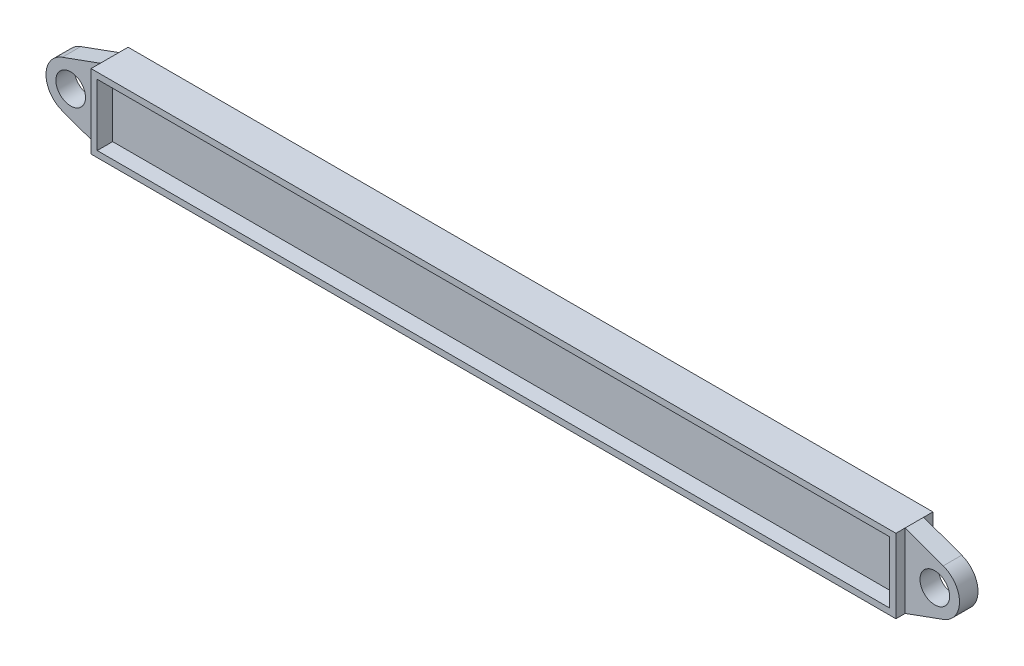
ISO-10303-21;
HEADER;
FILE_DESCRIPTION(('STEP AP214'),'2;1');
FILE_NAME('part.step','',(''),(''),'','','');
FILE_SCHEMA(('AUTOMOTIVE_DESIGN { 1 0 10303 214 1 1 1 1 }'));
ENDSEC;
DATA;
#1=APPLICATION_CONTEXT('core data for automotive mechanical design processes');
#2=APPLICATION_PROTOCOL_DEFINITION('international standard','automotive_design',2000,#1);
#3=PRODUCT_CONTEXT('',#1,'mechanical');
#4=PRODUCT('Part','Part','',(#3));
#5=PRODUCT_RELATED_PRODUCT_CATEGORY('part','',(#4));
#6=PRODUCT_DEFINITION_FORMATION('','',#4);
#7=PRODUCT_DEFINITION_CONTEXT('part definition',#1,'design');
#8=PRODUCT_DEFINITION('design','',#6,#7);
#9=PRODUCT_DEFINITION_SHAPE('','',#8);
#10=(LENGTH_UNIT() NAMED_UNIT(*) SI_UNIT(.MILLI.,.METRE.));
#11=(NAMED_UNIT(*) PLANE_ANGLE_UNIT() SI_UNIT($,.RADIAN.));
#12=(NAMED_UNIT(*) SI_UNIT($,.STERADIAN.) SOLID_ANGLE_UNIT());
#13=UNCERTAINTY_MEASURE_WITH_UNIT(LENGTH_MEASURE(1.E-05),#10,'distance_accuracy_value','');
#14=(GEOMETRIC_REPRESENTATION_CONTEXT(3) GLOBAL_UNCERTAINTY_ASSIGNED_CONTEXT((#13)) GLOBAL_UNIT_ASSIGNED_CONTEXT((#10,
#11,#12)) REPRESENTATION_CONTEXT('',''));
#15=CARTESIAN_POINT('',(0.,0.,0.));
#16=DIRECTION('',(0.,0.,1.));
#17=DIRECTION('',(1.,0.,0.));
#18=AXIS2_PLACEMENT_3D('',#15,#16,#17);
#19=CARTESIAN_POINT('',(0.,20.,30.));
#20=DIRECTION('',(0.,0.,-1.));
#21=DIRECTION('',(-1.,0.,0.));
#22=AXIS2_PLACEMENT_3D('',#19,#20,#21);
#23=CYLINDRICAL_SURFACE('',#22,20.);
#24=CARTESIAN_POINT('',(0.,20.,7.5));
#25=DIRECTION('',(0.,0.,-1.));
#26=DIRECTION('',(-1.,0.,0.));
#27=AXIS2_PLACEMENT_3D('',#24,#25,#26);
#28=CIRCLE('',#27,20.);
#29=CARTESIAN_POINT('',(-6.8302583783051,1.20245839250268,7.5));
#30=VERTEX_POINT('',#29);
#31=CARTESIAN_POINT('',(-6.8302583783051,38.7975416074973,7.5));
#32=VERTEX_POINT('',#31);
#33=EDGE_CURVE('E240',#30,#32,#28,.T.);
#34=ORIENTED_EDGE('',*,*,#33,.F.);
#35=DIRECTION('',(0.,0.,-1.));
#36=VECTOR('',#35,1.);
#37=CARTESIAN_POINT('',(-6.8302583783051,1.20245839250268,30.));
#38=LINE('',#37,#36);
#39=CARTESIAN_POINT('',(-6.83025837830511,1.20245839250268,22.5));
#40=VERTEX_POINT('',#39);
#41=EDGE_CURVE('E11',#40,#30,#38,.T.);
#42=ORIENTED_EDGE('',*,*,#41,.F.);
#43=CARTESIAN_POINT('',(0.,20.,22.5));
#44=DIRECTION('',(0.,0.,1.));
#45=DIRECTION('',(1.,0.,0.));
#46=AXIS2_PLACEMENT_3D('',#43,#44,#45);
#47=CIRCLE('',#46,20.);
#48=CARTESIAN_POINT('',(-6.8302583783051,38.7975416074973,22.5));
#49=VERTEX_POINT('',#48);
#50=EDGE_CURVE('E294',#49,#40,#47,.T.);
#51=ORIENTED_EDGE('',*,*,#50,.F.);
#52=DIRECTION('',(0.,0.,-1.));
#53=VECTOR('',#52,1.);
#54=CARTESIAN_POINT('',(-6.8302583783051,38.7975416074973,30.));
#55=LINE('',#54,#53);
#56=EDGE_CURVE('E306',#49,#32,#55,.T.);
#57=ORIENTED_EDGE('',*,*,#56,.T.);
#58=EDGE_LOOP('',(#34,#42,#51,#57));
#59=FACE_BOUND('',#58,.T.);
#60=ADVANCED_FACE('F33',(#59),#23,.T.);
#61=CARTESIAN_POINT('',(24.0000008050415,-9.9999977844467,30.));
#62=DIRECTION('',(0.341512918915255,0.939877080374866,0.));
#63=DIRECTION('',(-0.939877080374866,0.341512918915255,0.));
#64=AXIS2_PLACEMENT_3D('',#61,#62,#63);
#65=PLANE('',#64);
#66=DIRECTION('',(-0.939877080374866,0.341512918915255,0.));
#67=VECTOR('',#66,1.);
#68=CARTESIAN_POINT('',(24.0000008050415,-9.9999977844467,7.5));
#69=LINE('',#68,#67);
#70=CARTESIAN_POINT('',(24.0000008050415,-9.9999977844467,7.5));
#71=VERTEX_POINT('',#70);
#72=EDGE_CURVE('E248',#71,#30,#69,.T.);
#73=ORIENTED_EDGE('',*,*,#72,.F.);
#74=DIRECTION('',(0.,0.,-1.));
#75=VECTOR('',#74,1.);
#76=CARTESIAN_POINT('',(24.0000008050415,-9.9999977844467,30.));
#77=LINE('',#76,#75);
#78=CARTESIAN_POINT('',(24.0000008050415,-9.9999977844467,22.5));
#79=VERTEX_POINT('',#78);
#80=EDGE_CURVE('E331',#79,#71,#77,.T.);
#81=ORIENTED_EDGE('',*,*,#80,.F.);
#82=DIRECTION('',(0.939877080374866,-0.341512918915255,0.));
#83=VECTOR('',#82,1.);
#84=CARTESIAN_POINT('',(24.0000008050415,-9.9999977844467,22.5));
#85=LINE('',#84,#83);
#86=EDGE_CURVE('E285',#40,#79,#85,.T.);
#87=ORIENTED_EDGE('',*,*,#86,.F.);
#88=ORIENTED_EDGE('',*,*,#41,.T.);
#89=EDGE_LOOP('',(#73,#81,#87,#88));
#90=FACE_BOUND('',#89,.T.);
#91=ADVANCED_FACE('F367',(#90),#65,.F.);
#92=CARTESIAN_POINT('',(675.999999194958,-9.99999778444671,30.));
#93=DIRECTION('',(-0.341512918915256,0.939877080374866,0.));
#94=DIRECTION('',(-0.939877080374866,-0.341512918915256,0.));
#95=AXIS2_PLACEMENT_3D('',#92,#93,#94);
#96=PLANE('',#95);
#97=DIRECTION('',(-0.939877080374866,-0.341512918915256,0.));
#98=VECTOR('',#97,1.);
#99=CARTESIAN_POINT('',(675.999999194958,-9.99999778444671,7.5));
#100=LINE('',#99,#98);
#101=CARTESIAN_POINT('',(706.830258378305,1.20245839250267,7.5));
#102=VERTEX_POINT('',#101);
#103=CARTESIAN_POINT('',(675.999999194958,-9.99999778444671,7.5));
#104=VERTEX_POINT('',#103);
#105=EDGE_CURVE('E260',#102,#104,#100,.T.);
#106=ORIENTED_EDGE('',*,*,#105,.F.);
#107=DIRECTION('',(0.,0.,-1.));
#108=VECTOR('',#107,1.);
#109=CARTESIAN_POINT('',(706.830258378305,1.20245839250267,30.));
#110=LINE('',#109,#108);
#111=CARTESIAN_POINT('',(706.830258378305,1.20245839250267,22.5));
#112=VERTEX_POINT('',#111);
#113=EDGE_CURVE('E325',#112,#102,#110,.T.);
#114=ORIENTED_EDGE('',*,*,#113,.F.);
#115=DIRECTION('',(0.939877080374866,0.341512918915256,0.));
#116=VECTOR('',#115,1.);
#117=CARTESIAN_POINT('',(675.999999194958,-9.99999778444671,22.5));
#118=LINE('',#117,#116);
#119=CARTESIAN_POINT('',(675.999999194958,-9.99999778444671,22.5));
#120=VERTEX_POINT('',#119);
#121=EDGE_CURVE('E281',#120,#112,#118,.T.);
#122=ORIENTED_EDGE('',*,*,#121,.F.);
#123=DIRECTION('',(0.,0.,-1.));
#124=VECTOR('',#123,1.);
#125=CARTESIAN_POINT('',(675.999999194958,-9.99999778444671,30.));
#126=LINE('',#125,#124);
#127=EDGE_CURVE('E328',#120,#104,#126,.T.);
#128=ORIENTED_EDGE('',*,*,#127,.T.);
#129=EDGE_LOOP('',(#106,#114,#122,#128));
#130=FACE_BOUND('',#129,.T.);
#131=ADVANCED_FACE('F398',(#130),#96,.F.);
#132=CARTESIAN_POINT('',(700.,20.,30.));
#133=DIRECTION('',(0.,0.,-1.));
#134=DIRECTION('',(-1.,0.,0.));
#135=AXIS2_PLACEMENT_3D('',#132,#133,#134);
#136=CYLINDRICAL_SURFACE('',#135,20.);
#137=CARTESIAN_POINT('',(700.,20.,7.5));
#138=DIRECTION('',(0.,0.,-1.));
#139=DIRECTION('',(-1.,0.,0.));
#140=AXIS2_PLACEMENT_3D('',#137,#138,#139);
#141=CIRCLE('',#140,20.);
#142=CARTESIAN_POINT('',(706.830258378305,38.7975416074973,7.5));
#143=VERTEX_POINT('',#142);
#144=EDGE_CURVE('E258',#143,#102,#141,.T.);
#145=ORIENTED_EDGE('',*,*,#144,.F.);
#146=DIRECTION('',(0.,0.,-1.));
#147=VECTOR('',#146,1.);
#148=CARTESIAN_POINT('',(706.830258378305,38.7975416074973,30.));
#149=LINE('',#148,#147);
#150=CARTESIAN_POINT('',(706.830258378305,38.7975416074973,22.5));
#151=VERTEX_POINT('',#150);
#152=EDGE_CURVE('E322',#151,#143,#149,.T.);
#153=ORIENTED_EDGE('',*,*,#152,.F.);
#154=CARTESIAN_POINT('',(700.,20.,22.5));
#155=DIRECTION('',(0.,0.,1.));
#156=DIRECTION('',(1.,0.,0.));
#157=AXIS2_PLACEMENT_3D('',#154,#155,#156);
#158=CIRCLE('',#157,20.);
#159=EDGE_CURVE('E273',#112,#151,#158,.T.);
#160=ORIENTED_EDGE('',*,*,#159,.F.);
#161=ORIENTED_EDGE('',*,*,#113,.T.);
#162=EDGE_LOOP('',(#145,#153,#160,#161));
#163=FACE_BOUND('',#162,.T.);
#164=ADVANCED_FACE('F408',(#163),#136,.T.);
#165=CARTESIAN_POINT('',(675.999999194958,49.9999977844467,30.));
#166=DIRECTION('',(-0.341512918915256,-0.939877080374866,0.));
#167=DIRECTION('',(0.939877080374866,-0.341512918915256,0.));
#168=AXIS2_PLACEMENT_3D('',#165,#166,#167);
#169=PLANE('',#168);
#170=DIRECTION('',(0.939877080374866,-0.341512918915256,0.));
#171=VECTOR('',#170,1.);
#172=CARTESIAN_POINT('',(706.830258378305,38.7975416074973,7.5));
#173=LINE('',#172,#171);
#174=CARTESIAN_POINT('',(675.999999194958,49.9999977844467,7.5));
#175=VERTEX_POINT('',#174);
#176=EDGE_CURVE('E266',#175,#143,#173,.T.);
#177=ORIENTED_EDGE('',*,*,#176,.F.);
#178=DIRECTION('',(0.,0.,-1.));
#179=VECTOR('',#178,1.);
#180=CARTESIAN_POINT('',(675.999999194958,49.9999977844467,30.));
#181=LINE('',#180,#179);
#182=CARTESIAN_POINT('',(675.999999194958,49.9999977844467,22.5));
#183=VERTEX_POINT('',#182);
#184=EDGE_CURVE('E318',#183,#175,#181,.T.);
#185=ORIENTED_EDGE('',*,*,#184,.F.);
#186=DIRECTION('',(-0.939877080374866,0.341512918915256,0.));
#187=VECTOR('',#186,1.);
#188=CARTESIAN_POINT('',(706.830258378305,38.7975416074973,22.5));
#189=LINE('',#188,#187);
#190=EDGE_CURVE('E275',#151,#183,#189,.T.);
#191=ORIENTED_EDGE('',*,*,#190,.F.);
#192=ORIENTED_EDGE('',*,*,#152,.T.);
#193=EDGE_LOOP('',(#177,#185,#191,#192));
#194=FACE_BOUND('',#193,.T.);
#195=ADVANCED_FACE('F411',(#194),#169,.F.);
#196=CARTESIAN_POINT('',(24.0000008050415,49.9999977844467,30.));
#197=DIRECTION('',(0.341512918915255,-0.939877080374866,0.));
#198=DIRECTION('',(0.939877080374866,0.341512918915255,0.));
#199=AXIS2_PLACEMENT_3D('',#196,#197,#198);
#200=PLANE('',#199);
#201=DIRECTION('',(0.939877080374866,0.341512918915255,0.));
#202=VECTOR('',#201,1.);
#203=CARTESIAN_POINT('',(-6.8302583783051,38.7975416074973,7.5));
#204=LINE('',#203,#202);
#205=CARTESIAN_POINT('',(24.0000008050415,49.9999977844467,7.5));
#206=VERTEX_POINT('',#205);
#207=EDGE_CURVE('E242',#32,#206,#204,.T.);
#208=ORIENTED_EDGE('',*,*,#207,.F.);
#209=ORIENTED_EDGE('',*,*,#56,.F.);
#210=DIRECTION('',(-0.939877080374866,-0.341512918915255,0.));
#211=VECTOR('',#210,1.);
#212=CARTESIAN_POINT('',(24.0000008050415,49.9999977844467,22.5));
#213=LINE('',#212,#211);
#214=CARTESIAN_POINT('',(24.0000008050415,49.9999977844467,22.5));
#215=VERTEX_POINT('',#214);
#216=EDGE_CURVE('E292',#215,#49,#213,.T.);
#217=ORIENTED_EDGE('',*,*,#216,.F.);
#218=DIRECTION('',(0.,0.,-1.));
#219=VECTOR('',#218,1.);
#220=CARTESIAN_POINT('',(24.0000008050415,49.9999977844467,30.));
#221=LINE('',#220,#219);
#222=EDGE_CURVE('E314',#215,#206,#221,.T.);
#223=ORIENTED_EDGE('',*,*,#222,.T.);
#224=EDGE_LOOP('',(#208,#209,#217,#223));
#225=FACE_BOUND('',#224,.T.);
#226=ADVANCED_FACE('F358',(#225),#200,.F.);
#227=CARTESIAN_POINT('',(0.,20.,30.));
#228=DIRECTION('',(0.,0.,-1.));
#229=DIRECTION('',(-1.,0.,0.));
#230=AXIS2_PLACEMENT_3D('',#227,#228,#229);
#231=CYLINDRICAL_SURFACE('',#230,12.);
#232=CARTESIAN_POINT('',(0.,20.,22.5));
#233=DIRECTION('',(0.,0.,1.));
#234=DIRECTION('',(1.,0.,0.));
#235=AXIS2_PLACEMENT_3D('',#232,#233,#234);
#236=CIRCLE('',#235,12.);
#237=CARTESIAN_POINT('',(12.,20.,22.5));
#238=VERTEX_POINT('',#237);
#239=EDGE_CURVE('E286',#238,#238,#236,.T.);
#240=ORIENTED_EDGE('',*,*,#239,.T.);
#241=EDGE_LOOP('',(#240));
#242=FACE_BOUND('',#241,.T.);
#243=CARTESIAN_POINT('',(0.,20.,7.5));
#244=DIRECTION('',(0.,0.,-1.));
#245=DIRECTION('',(-1.,0.,0.));
#246=AXIS2_PLACEMENT_3D('',#243,#244,#245);
#247=CIRCLE('',#246,12.);
#248=CARTESIAN_POINT('',(-12.,20.,7.5));
#249=VERTEX_POINT('',#248);
#250=EDGE_CURVE('E36',#249,#249,#247,.T.);
#251=ORIENTED_EDGE('',*,*,#250,.T.);
#252=EDGE_LOOP('',(#251));
#253=FACE_BOUND('',#252,.T.);
#254=ADVANCED_FACE('F341',(#242,#253),#231,.F.);
#255=CARTESIAN_POINT('',(700.,20.,30.));
#256=DIRECTION('',(0.,0.,-1.));
#257=DIRECTION('',(-1.,0.,0.));
#258=AXIS2_PLACEMENT_3D('',#255,#256,#257);
#259=CYLINDRICAL_SURFACE('',#258,12.);
#260=CARTESIAN_POINT('',(700.,20.,22.5));
#261=DIRECTION('',(0.,0.,1.));
#262=DIRECTION('',(1.,0.,0.));
#263=AXIS2_PLACEMENT_3D('',#260,#261,#262);
#264=CIRCLE('',#263,12.);
#265=CARTESIAN_POINT('',(712.,20.,22.5));
#266=VERTEX_POINT('',#265);
#267=EDGE_CURVE('E283',#266,#266,#264,.T.);
#268=ORIENTED_EDGE('',*,*,#267,.T.);
#269=EDGE_LOOP('',(#268));
#270=FACE_BOUND('',#269,.T.);
#271=CARTESIAN_POINT('',(700.,20.,7.5));
#272=DIRECTION('',(0.,0.,-1.));
#273=DIRECTION('',(-1.,0.,0.));
#274=AXIS2_PLACEMENT_3D('',#271,#272,#273);
#275=CIRCLE('',#274,12.);
#276=CARTESIAN_POINT('',(688.,20.,7.5));
#277=VERTEX_POINT('',#276);
#278=EDGE_CURVE('E256',#277,#277,#275,.T.);
#279=ORIENTED_EDGE('',*,*,#278,.T.);
#280=EDGE_LOOP('',(#279));
#281=FACE_BOUND('',#280,.T.);
#282=ADVANCED_FACE('F452',(#270,#281),#259,.F.);
#283=CARTESIAN_POINT('',(0.,20.,30.));
#284=DIRECTION('',(0.,0.,1.));
#285=DIRECTION('',(1.,0.,0.));
#286=AXIS2_PLACEMENT_3D('',#283,#284,#285);
#287=PLANE('',#286);
#288=DIRECTION('',(0.,1.,0.));
#289=VECTOR('',#288,1.);
#290=CARTESIAN_POINT('',(671.000000805042,44.9999977844468,30.));
#291=LINE('',#290,#289);
#292=CARTESIAN_POINT('',(671.000000805042,-5.00000221555314,30.));
#293=VERTEX_POINT('',#292);
#294=CARTESIAN_POINT('',(671.000000805042,44.9999977844468,30.));
#295=VERTEX_POINT('',#294);
#296=EDGE_CURVE('E49',#293,#295,#291,.T.);
#297=ORIENTED_EDGE('',*,*,#296,.F.);
#298=DIRECTION('',(1.,0.,0.));
#299=VECTOR('',#298,1.);
#300=CARTESIAN_POINT('',(671.000000805042,-5.00000221555314,30.));
#301=LINE('',#300,#299);
#302=CARTESIAN_POINT('',(29.0000008050415,-5.0000022155533,30.));
#303=VERTEX_POINT('',#302);
#304=EDGE_CURVE('E191',#303,#293,#301,.T.);
#305=ORIENTED_EDGE('',*,*,#304,.F.);
#306=DIRECTION('',(0.,-1.,0.));
#307=VECTOR('',#306,1.);
#308=CARTESIAN_POINT('',(29.0000008050415,-5.0000022155533,30.));
#309=LINE('',#308,#307);
#310=CARTESIAN_POINT('',(29.0000008050415,44.9999977844467,30.));
#311=VERTEX_POINT('',#310);
#312=EDGE_CURVE('E194',#311,#303,#309,.T.);
#313=ORIENTED_EDGE('',*,*,#312,.F.);
#314=DIRECTION('',(-1.,0.,0.));
#315=VECTOR('',#314,1.);
#316=CARTESIAN_POINT('',(29.0000008050415,44.9999977844467,30.));
#317=LINE('',#316,#315);
#318=EDGE_CURVE('E200',#295,#311,#317,.T.);
#319=ORIENTED_EDGE('',*,*,#318,.F.);
#320=EDGE_LOOP('',(#297,#305,#313,#319));
#321=FACE_BOUND('',#320,.T.);
#322=DIRECTION('',(0.,-1.,0.));
#323=VECTOR('',#322,1.);
#324=CARTESIAN_POINT('',(675.999999194958,49.9999977844467,30.));
#325=LINE('',#324,#323);
#326=CARTESIAN_POINT('',(675.999999194958,49.9999977844467,30.));
#327=VERTEX_POINT('',#326);
#328=CARTESIAN_POINT('',(675.999999194958,-9.99999778444671,30.));
#329=VERTEX_POINT('',#328);
#330=EDGE_CURVE('E276',#327,#329,#325,.T.);
#331=ORIENTED_EDGE('',*,*,#330,.F.);
#332=DIRECTION('',(-1.,0.,0.));
#333=VECTOR('',#332,1.);
#334=CARTESIAN_POINT('',(675.999999194958,49.9999977844467,30.));
#335=LINE('',#334,#333);
#336=CARTESIAN_POINT('',(24.0000008050415,49.9999977844467,30.));
#337=VERTEX_POINT('',#336);
#338=EDGE_CURVE('E302',#327,#337,#335,.T.);
#339=ORIENTED_EDGE('',*,*,#338,.T.);
#340=DIRECTION('',(0.,1.,0.));
#341=VECTOR('',#340,1.);
#342=CARTESIAN_POINT('',(24.0000008050415,49.9999977844467,30.));
#343=LINE('',#342,#341);
#344=CARTESIAN_POINT('',(24.0000008050415,-9.9999977844467,30.));
#345=VERTEX_POINT('',#344);
#346=EDGE_CURVE('E289',#345,#337,#343,.T.);
#347=ORIENTED_EDGE('',*,*,#346,.F.);
#348=DIRECTION('',(1.,0.,0.));
#349=VECTOR('',#348,1.);
#350=CARTESIAN_POINT('',(675.999999194958,-9.99999778444671,30.));
#351=LINE('',#350,#349);
#352=EDGE_CURVE('E299',#345,#329,#351,.T.);
#353=ORIENTED_EDGE('',*,*,#352,.T.);
#354=EDGE_LOOP('',(#331,#339,#347,#353));
#355=FACE_BOUND('',#354,.T.);
#356=ADVANCED_FACE('F378',(#321,#355),#287,.T.);
#357=CARTESIAN_POINT('',(0.,20.,0.));
#358=DIRECTION('',(0.,0.,1.));
#359=DIRECTION('',(1.,0.,0.));
#360=AXIS2_PLACEMENT_3D('',#357,#358,#359);
#361=PLANE('',#360);
#362=DIRECTION('',(0.,-1.,0.));
#363=VECTOR('',#362,1.);
#364=CARTESIAN_POINT('',(670.999999194958,45.0000022155533,0.));
#365=LINE('',#364,#363);
#366=CARTESIAN_POINT('',(670.999999194958,45.0000022155533,0.));
#367=VERTEX_POINT('',#366);
#368=CARTESIAN_POINT('',(670.999999194958,-4.9999977844467,0.));
#369=VERTEX_POINT('',#368);
#370=EDGE_CURVE('E224',#367,#369,#365,.T.);
#371=ORIENTED_EDGE('',*,*,#370,.F.);
#372=DIRECTION('',(1.,0.,0.));
#373=VECTOR('',#372,1.);
#374=CARTESIAN_POINT('',(28.9999991949585,45.0000022155537,0.));
#375=LINE('',#374,#373);
#376=CARTESIAN_POINT('',(28.9999991949585,45.0000022155537,0.));
#377=VERTEX_POINT('',#376);
#378=EDGE_CURVE('E57',#377,#367,#375,.T.);
#379=ORIENTED_EDGE('',*,*,#378,.F.);
#380=DIRECTION('',(0.,1.,0.));
#381=VECTOR('',#380,1.);
#382=CARTESIAN_POINT('',(28.9999991949584,-4.99999778444662,0.));
#383=LINE('',#382,#381);
#384=CARTESIAN_POINT('',(28.9999991949584,-4.99999778444662,0.));
#385=VERTEX_POINT('',#384);
#386=EDGE_CURVE('E213',#385,#377,#383,.T.);
#387=ORIENTED_EDGE('',*,*,#386,.F.);
#388=DIRECTION('',(-1.,0.,0.));
#389=VECTOR('',#388,1.);
#390=CARTESIAN_POINT('',(670.999999194958,-4.9999977844467,0.));
#391=LINE('',#390,#389);
#392=EDGE_CURVE('E227',#369,#385,#391,.T.);
#393=ORIENTED_EDGE('',*,*,#392,.F.);
#394=EDGE_LOOP('',(#371,#379,#387,#393));
#395=FACE_BOUND('',#394,.T.);
#396=DIRECTION('',(1.,0.,0.));
#397=VECTOR('',#396,1.);
#398=CARTESIAN_POINT('',(675.999999194958,-9.99999778444671,0.));
#399=LINE('',#398,#397);
#400=CARTESIAN_POINT('',(24.0000008050415,-9.9999977844467,0.));
#401=VERTEX_POINT('',#400);
#402=CARTESIAN_POINT('',(675.999999194958,-9.99999778444671,0.));
#403=VERTEX_POINT('',#402);
#404=EDGE_CURVE('E307',#401,#403,#399,.T.);
#405=ORIENTED_EDGE('',*,*,#404,.F.);
#406=DIRECTION('',(0.,-1.,0.));
#407=VECTOR('',#406,1.);
#408=CARTESIAN_POINT('',(24.0000008050415,49.9999977844467,0.));
#409=LINE('',#408,#407);
#410=CARTESIAN_POINT('',(24.0000008050415,49.9999977844467,0.));
#411=VERTEX_POINT('',#410);
#412=EDGE_CURVE('E243',#411,#401,#409,.T.);
#413=ORIENTED_EDGE('',*,*,#412,.F.);
#414=DIRECTION('',(-1.,0.,0.));
#415=VECTOR('',#414,1.);
#416=CARTESIAN_POINT('',(675.999999194958,49.9999977844467,0.));
#417=LINE('',#416,#415);
#418=CARTESIAN_POINT('',(675.999999194958,49.9999977844467,0.));
#419=VERTEX_POINT('',#418);
#420=EDGE_CURVE('E303',#419,#411,#417,.T.);
#421=ORIENTED_EDGE('',*,*,#420,.F.);
#422=DIRECTION('',(0.,1.,0.));
#423=VECTOR('',#422,1.);
#424=CARTESIAN_POINT('',(675.999999194958,49.9999977844467,0.));
#425=LINE('',#424,#423);
#426=EDGE_CURVE('E234',#403,#419,#425,.T.);
#427=ORIENTED_EDGE('',*,*,#426,.F.);
#428=EDGE_LOOP('',(#405,#413,#421,#427));
#429=FACE_BOUND('',#428,.T.);
#430=ADVANCED_FACE('F389',(#395,#429),#361,.F.);
#431=CARTESIAN_POINT('',(675.999999194958,-9.99999778444671,30.));
#432=DIRECTION('',(0.,1.,0.));
#433=DIRECTION('',(-1.,0.,0.));
#434=AXIS2_PLACEMENT_3D('',#431,#432,#433);
#435=PLANE('',#434);
#436=ORIENTED_EDGE('',*,*,#404,.T.);
#437=DIRECTION('',(0.,0.,-1.));
#438=VECTOR('',#437,1.);
#439=CARTESIAN_POINT('',(675.999999194958,-9.99999778444671,7.5));
#440=LINE('',#439,#438);
#441=EDGE_CURVE('E268',#104,#403,#440,.T.);
#442=ORIENTED_EDGE('',*,*,#441,.F.);
#443=ORIENTED_EDGE('',*,*,#127,.F.);
#444=EDGE_CURVE('E329',#329,#120,#126,.T.);
#445=ORIENTED_EDGE('',*,*,#444,.F.);
#446=ORIENTED_EDGE('',*,*,#352,.F.);
#447=EDGE_CURVE('E41',#345,#79,#77,.T.);
#448=ORIENTED_EDGE('',*,*,#447,.T.);
#449=ORIENTED_EDGE('',*,*,#80,.T.);
#450=DIRECTION('',(0.,0.,-1.));
#451=VECTOR('',#450,1.);
#452=CARTESIAN_POINT('',(24.0000008050415,-9.9999977844467,7.5));
#453=LINE('',#452,#451);
#454=EDGE_CURVE('E253',#71,#401,#453,.T.);
#455=ORIENTED_EDGE('',*,*,#454,.T.);
#456=EDGE_LOOP('',(#436,#442,#443,#445,#446,#448,#449,#455));
#457=FACE_BOUND('',#456,.T.);
#458=ADVANCED_FACE('F371',(#457),#435,.F.);
#459=CARTESIAN_POINT('',(675.999999194958,49.9999977844467,30.));
#460=DIRECTION('',(0.,-1.,0.));
#461=DIRECTION('',(0.,0.,-1.));
#462=AXIS2_PLACEMENT_3D('',#459,#460,#461);
#463=PLANE('',#462);
#464=ORIENTED_EDGE('',*,*,#420,.T.);
#465=DIRECTION('',(0.,0.,-1.));
#466=VECTOR('',#465,1.);
#467=CARTESIAN_POINT('',(24.0000008050415,49.9999977844467,7.5));
#468=LINE('',#467,#466);
#469=EDGE_CURVE('E250',#206,#411,#468,.T.);
#470=ORIENTED_EDGE('',*,*,#469,.F.);
#471=ORIENTED_EDGE('',*,*,#222,.F.);
#472=EDGE_CURVE('E315',#337,#215,#221,.T.);
#473=ORIENTED_EDGE('',*,*,#472,.F.);
#474=ORIENTED_EDGE('',*,*,#338,.F.);
#475=EDGE_CURVE('E319',#327,#183,#181,.T.);
#476=ORIENTED_EDGE('',*,*,#475,.T.);
#477=ORIENTED_EDGE('',*,*,#184,.T.);
#478=DIRECTION('',(0.,0.,-1.));
#479=VECTOR('',#478,1.);
#480=CARTESIAN_POINT('',(675.999999194958,49.9999977844467,7.5));
#481=LINE('',#480,#479);
#482=EDGE_CURVE('E252',#175,#419,#481,.T.);
#483=ORIENTED_EDGE('',*,*,#482,.T.);
#484=EDGE_LOOP('',(#464,#470,#471,#473,#474,#476,#477,#483));
#485=FACE_BOUND('',#484,.T.);
#486=ADVANCED_FACE('F382',(#485),#463,.F.);
#487=CARTESIAN_POINT('',(675.999999194958,49.9999977844467,22.5));
#488=DIRECTION('',(-1.,0.,0.));
#489=DIRECTION('',(0.,0.,1.));
#490=AXIS2_PLACEMENT_3D('',#487,#488,#489);
#491=PLANE('',#490);
#492=ORIENTED_EDGE('',*,*,#330,.T.);
#493=ORIENTED_EDGE('',*,*,#444,.T.);
#494=DIRECTION('',(0.,-1.,0.));
#495=VECTOR('',#494,1.);
#496=CARTESIAN_POINT('',(675.999999194958,49.9999977844467,22.5));
#497=LINE('',#496,#495);
#498=EDGE_CURVE('E278',#183,#120,#497,.T.);
#499=ORIENTED_EDGE('',*,*,#498,.F.);
#500=ORIENTED_EDGE('',*,*,#475,.F.);
#501=EDGE_LOOP('',(#492,#493,#499,#500));
#502=FACE_BOUND('',#501,.T.);
#503=ADVANCED_FACE('F415',(#502),#491,.F.);
#504=CARTESIAN_POINT('',(700.,20.,22.5));
#505=DIRECTION('',(0.,0.,1.));
#506=DIRECTION('',(1.,0.,0.));
#507=AXIS2_PLACEMENT_3D('',#504,#505,#506);
#508=PLANE('',#507);
#509=ORIENTED_EDGE('',*,*,#267,.F.);
#510=EDGE_LOOP('',(#509));
#511=FACE_BOUND('',#510,.T.);
#512=ORIENTED_EDGE('',*,*,#159,.T.);
#513=ORIENTED_EDGE('',*,*,#190,.T.);
#514=ORIENTED_EDGE('',*,*,#498,.T.);
#515=ORIENTED_EDGE('',*,*,#121,.T.);
#516=EDGE_LOOP('',(#512,#513,#514,#515));
#517=FACE_BOUND('',#516,.T.);
#518=ADVANCED_FACE('F402',(#511,#517),#508,.T.);
#519=CARTESIAN_POINT('',(24.0000008050415,49.9999977844467,22.5));
#520=DIRECTION('',(1.,0.,0.));
#521=DIRECTION('',(0.,0.,-1.));
#522=AXIS2_PLACEMENT_3D('',#519,#520,#521);
#523=PLANE('',#522);
#524=ORIENTED_EDGE('',*,*,#346,.T.);
#525=ORIENTED_EDGE('',*,*,#472,.T.);
#526=DIRECTION('',(0.,1.,0.));
#527=VECTOR('',#526,1.);
#528=CARTESIAN_POINT('',(24.0000008050415,49.9999977844467,22.5));
#529=LINE('',#528,#527);
#530=EDGE_CURVE('E290',#79,#215,#529,.T.);
#531=ORIENTED_EDGE('',*,*,#530,.F.);
#532=ORIENTED_EDGE('',*,*,#447,.F.);
#533=EDGE_LOOP('',(#524,#525,#531,#532));
#534=FACE_BOUND('',#533,.T.);
#535=ADVANCED_FACE('F375',(#534),#523,.F.);
#536=CARTESIAN_POINT('',(0.,20.,22.5));
#537=DIRECTION('',(0.,0.,1.));
#538=DIRECTION('',(1.,0.,0.));
#539=AXIS2_PLACEMENT_3D('',#536,#537,#538);
#540=PLANE('',#539);
#541=ORIENTED_EDGE('',*,*,#239,.F.);
#542=EDGE_LOOP('',(#541));
#543=FACE_BOUND('',#542,.T.);
#544=ORIENTED_EDGE('',*,*,#530,.T.);
#545=ORIENTED_EDGE('',*,*,#216,.T.);
#546=ORIENTED_EDGE('',*,*,#50,.T.);
#547=ORIENTED_EDGE('',*,*,#86,.T.);
#548=EDGE_LOOP('',(#544,#545,#546,#547));
#549=FACE_BOUND('',#548,.T.);
#550=ADVANCED_FACE('F364',(#543,#549),#540,.T.);
#551=CARTESIAN_POINT('',(675.999999194958,49.9999977844467,7.5));
#552=DIRECTION('',(-1.,0.,0.));
#553=DIRECTION('',(0.,0.,1.));
#554=AXIS2_PLACEMENT_3D('',#551,#552,#553);
#555=PLANE('',#554);
#556=ORIENTED_EDGE('',*,*,#426,.T.);
#557=ORIENTED_EDGE('',*,*,#482,.F.);
#558=DIRECTION('',(0.,1.,0.));
#559=VECTOR('',#558,1.);
#560=CARTESIAN_POINT('',(675.999999194958,49.9999977844467,7.5));
#561=LINE('',#560,#559);
#562=EDGE_CURVE('E263',#104,#175,#561,.T.);
#563=ORIENTED_EDGE('',*,*,#562,.F.);
#564=ORIENTED_EDGE('',*,*,#441,.T.);
#565=EDGE_LOOP('',(#556,#557,#563,#564));
#566=FACE_BOUND('',#565,.T.);
#567=ADVANCED_FACE('F416',(#566),#555,.F.);
#568=CARTESIAN_POINT('',(700.,20.,7.5));
#569=DIRECTION('',(0.,0.,-1.));
#570=DIRECTION('',(-1.,0.,0.));
#571=AXIS2_PLACEMENT_3D('',#568,#569,#570);
#572=PLANE('',#571);
#573=ORIENTED_EDGE('',*,*,#278,.F.);
#574=EDGE_LOOP('',(#573));
#575=FACE_BOUND('',#574,.T.);
#576=ORIENTED_EDGE('',*,*,#144,.T.);
#577=ORIENTED_EDGE('',*,*,#105,.T.);
#578=ORIENTED_EDGE('',*,*,#562,.T.);
#579=ORIENTED_EDGE('',*,*,#176,.T.);
#580=EDGE_LOOP('',(#576,#577,#578,#579));
#581=FACE_BOUND('',#580,.T.);
#582=ADVANCED_FACE('F418',(#575,#581),#572,.T.);
#583=CARTESIAN_POINT('',(24.0000008050415,49.9999977844467,7.5));
#584=DIRECTION('',(1.,0.,0.));
#585=DIRECTION('',(0.,0.,-1.));
#586=AXIS2_PLACEMENT_3D('',#583,#584,#585);
#587=PLANE('',#586);
#588=ORIENTED_EDGE('',*,*,#412,.T.);
#589=ORIENTED_EDGE('',*,*,#454,.F.);
#590=DIRECTION('',(0.,-1.,0.));
#591=VECTOR('',#590,1.);
#592=CARTESIAN_POINT('',(24.0000008050415,49.9999977844467,7.5));
#593=LINE('',#592,#591);
#594=EDGE_CURVE('E245',#206,#71,#593,.T.);
#595=ORIENTED_EDGE('',*,*,#594,.F.);
#596=ORIENTED_EDGE('',*,*,#469,.T.);
#597=EDGE_LOOP('',(#588,#589,#595,#596));
#598=FACE_BOUND('',#597,.T.);
#599=ADVANCED_FACE('F347',(#598),#587,.F.);
#600=CARTESIAN_POINT('',(0.,20.,7.5));
#601=DIRECTION('',(0.,0.,-1.));
#602=DIRECTION('',(-1.,0.,0.));
#603=AXIS2_PLACEMENT_3D('',#600,#601,#602);
#604=PLANE('',#603);
#605=ORIENTED_EDGE('',*,*,#250,.F.);
#606=EDGE_LOOP('',(#605));
#607=FACE_BOUND('',#606,.T.);
#608=ORIENTED_EDGE('',*,*,#33,.T.);
#609=ORIENTED_EDGE('',*,*,#207,.T.);
#610=ORIENTED_EDGE('',*,*,#594,.T.);
#611=ORIENTED_EDGE('',*,*,#72,.T.);
#612=EDGE_LOOP('',(#608,#609,#610,#611));
#613=FACE_BOUND('',#612,.T.);
#614=ADVANCED_FACE('F343',(#607,#613),#604,.T.);
#615=CARTESIAN_POINT('',(28.9999991949585,45.0000022155537,12.5));
#616=DIRECTION('',(0.,1.,0.));
#617=DIRECTION('',(-1.,0.,0.));
#618=AXIS2_PLACEMENT_3D('',#615,#616,#617);
#619=PLANE('',#618);
#620=ORIENTED_EDGE('',*,*,#378,.T.);
#621=DIRECTION('',(0.,0.,-1.));
#622=VECTOR('',#621,1.);
#623=CARTESIAN_POINT('',(670.999999194958,45.0000022155533,12.5));
#624=LINE('',#623,#622);
#625=CARTESIAN_POINT('',(670.999999194958,45.0000022155533,12.5));
#626=VERTEX_POINT('',#625);
#627=EDGE_CURVE('E222',#626,#367,#624,.T.);
#628=ORIENTED_EDGE('',*,*,#627,.F.);
#629=DIRECTION('',(1.,0.,0.));
#630=VECTOR('',#629,1.);
#631=CARTESIAN_POINT('',(28.9999991949585,45.0000022155537,12.5));
#632=LINE('',#631,#630);
#633=CARTESIAN_POINT('',(28.9999991949585,45.0000022155537,12.5));
#634=VERTEX_POINT('',#633);
#635=EDGE_CURVE('E209',#634,#626,#632,.T.);
#636=ORIENTED_EDGE('',*,*,#635,.F.);
#637=DIRECTION('',(0.,0.,-1.));
#638=VECTOR('',#637,1.);
#639=CARTESIAN_POINT('',(28.9999991949585,45.0000022155537,12.5));
#640=LINE('',#639,#638);
#641=EDGE_CURVE('E232',#634,#377,#640,.T.);
#642=ORIENTED_EDGE('',*,*,#641,.T.);
#643=EDGE_LOOP('',(#620,#628,#636,#642));
#644=FACE_BOUND('',#643,.T.);
#645=ADVANCED_FACE('F346',(#644),#619,.F.);
#646=CARTESIAN_POINT('',(28.9999991949584,-4.99999778444662,12.5));
#647=DIRECTION('',(-1.,0.,0.));
#648=DIRECTION('',(0.,-1.,0.));
#649=AXIS2_PLACEMENT_3D('',#646,#647,#648);
#650=PLANE('',#649);
#651=ORIENTED_EDGE('',*,*,#386,.T.);
#652=ORIENTED_EDGE('',*,*,#641,.F.);
#653=DIRECTION('',(0.,1.,0.));
#654=VECTOR('',#653,1.);
#655=CARTESIAN_POINT('',(28.9999991949584,-4.99999778444662,12.5));
#656=LINE('',#655,#654);
#657=CARTESIAN_POINT('',(28.9999991949584,-4.99999778444662,12.5));
#658=VERTEX_POINT('',#657);
#659=EDGE_CURVE('E219',#658,#634,#656,.T.);
#660=ORIENTED_EDGE('',*,*,#659,.F.);
#661=DIRECTION('',(0.,0.,-1.));
#662=VECTOR('',#661,1.);
#663=CARTESIAN_POINT('',(28.9999991949584,-4.99999778444662,12.5));
#664=LINE('',#663,#662);
#665=EDGE_CURVE('E235',#658,#385,#664,.T.);
#666=ORIENTED_EDGE('',*,*,#665,.T.);
#667=EDGE_LOOP('',(#651,#652,#660,#666));
#668=FACE_BOUND('',#667,.T.);
#669=ADVANCED_FACE('F524',(#668),#650,.F.);
#670=CARTESIAN_POINT('',(670.999999194958,-4.9999977844467,12.5));
#671=DIRECTION('',(0.,-1.,0.));
#672=DIRECTION('',(1.,0.,0.));
#673=AXIS2_PLACEMENT_3D('',#670,#671,#672);
#674=PLANE('',#673);
#675=ORIENTED_EDGE('',*,*,#392,.T.);
#676=ORIENTED_EDGE('',*,*,#665,.F.);
#677=DIRECTION('',(-1.,0.,0.));
#678=VECTOR('',#677,1.);
#679=CARTESIAN_POINT('',(670.999999194958,-4.9999977844467,12.5));
#680=LINE('',#679,#678);
#681=CARTESIAN_POINT('',(670.999999194958,-4.9999977844467,12.5));
#682=VERTEX_POINT('',#681);
#683=EDGE_CURVE('E216',#682,#658,#680,.T.);
#684=ORIENTED_EDGE('',*,*,#683,.F.);
#685=DIRECTION('',(0.,0.,-1.));
#686=VECTOR('',#685,1.);
#687=CARTESIAN_POINT('',(670.999999194958,-4.9999977844467,12.5));
#688=LINE('',#687,#686);
#689=EDGE_CURVE('E237',#682,#369,#688,.T.);
#690=ORIENTED_EDGE('',*,*,#689,.T.);
#691=EDGE_LOOP('',(#675,#676,#684,#690));
#692=FACE_BOUND('',#691,.T.);
#693=ADVANCED_FACE('F533',(#692),#674,.F.);
#694=CARTESIAN_POINT('',(670.999999194958,45.0000022155533,12.5));
#695=DIRECTION('',(1.,0.,0.));
#696=DIRECTION('',(0.,0.,-1.));
#697=AXIS2_PLACEMENT_3D('',#694,#695,#696);
#698=PLANE('',#697);
#699=ORIENTED_EDGE('',*,*,#370,.T.);
#700=ORIENTED_EDGE('',*,*,#689,.F.);
#701=DIRECTION('',(0.,-1.,0.));
#702=VECTOR('',#701,1.);
#703=CARTESIAN_POINT('',(670.999999194958,45.0000022155533,12.5));
#704=LINE('',#703,#702);
#705=EDGE_CURVE('E212',#626,#682,#704,.T.);
#706=ORIENTED_EDGE('',*,*,#705,.F.);
#707=ORIENTED_EDGE('',*,*,#627,.T.);
#708=EDGE_LOOP('',(#699,#700,#706,#707));
#709=FACE_BOUND('',#708,.T.);
#710=ADVANCED_FACE('F543',(#709),#698,.F.);
#711=CARTESIAN_POINT('',(0.,0.,12.5));
#712=DIRECTION('',(0.,0.,-1.));
#713=DIRECTION('',(-1.,0.,0.));
#714=AXIS2_PLACEMENT_3D('',#711,#712,#713);
#715=PLANE('',#714);
#716=ORIENTED_EDGE('',*,*,#635,.T.);
#717=ORIENTED_EDGE('',*,*,#705,.T.);
#718=ORIENTED_EDGE('',*,*,#683,.T.);
#719=ORIENTED_EDGE('',*,*,#659,.T.);
#720=EDGE_LOOP('',(#716,#717,#718,#719));
#721=FACE_BOUND('',#720,.T.);
#722=ADVANCED_FACE('F553',(#721),#715,.T.);
#723=CARTESIAN_POINT('',(671.000000805042,44.9999977844468,17.5));
#724=DIRECTION('',(1.,0.,0.));
#725=DIRECTION('',(0.,0.,-1.));
#726=AXIS2_PLACEMENT_3D('',#723,#724,#725);
#727=PLANE('',#726);
#728=ORIENTED_EDGE('',*,*,#296,.T.);
#729=DIRECTION('',(0.,0.,1.));
#730=VECTOR('',#729,1.);
#731=CARTESIAN_POINT('',(671.000000805042,44.9999977844468,17.5));
#732=LINE('',#731,#730);
#733=CARTESIAN_POINT('',(671.000000805042,44.9999977844468,17.5));
#734=VERTEX_POINT('',#733);
#735=EDGE_CURVE('E169',#734,#295,#732,.T.);
#736=ORIENTED_EDGE('',*,*,#735,.F.);
#737=DIRECTION('',(0.,1.,0.));
#738=VECTOR('',#737,1.);
#739=CARTESIAN_POINT('',(671.000000805042,44.9999977844468,17.5));
#740=LINE('',#739,#738);
#741=CARTESIAN_POINT('',(671.000000805042,-5.00000221555314,17.5));
#742=VERTEX_POINT('',#741);
#743=EDGE_CURVE('E173',#742,#734,#740,.T.);
#744=ORIENTED_EDGE('',*,*,#743,.F.);
#745=DIRECTION('',(0.,0.,1.));
#746=VECTOR('',#745,1.);
#747=CARTESIAN_POINT('',(671.000000805042,-5.00000221555314,17.5));
#748=LINE('',#747,#746);
#749=EDGE_CURVE('E204',#742,#293,#748,.T.);
#750=ORIENTED_EDGE('',*,*,#749,.T.);
#751=EDGE_LOOP('',(#728,#736,#744,#750));
#752=FACE_BOUND('',#751,.T.);
#753=ADVANCED_FACE('F171',(#752),#727,.F.);
#754=CARTESIAN_POINT('',(671.000000805042,-5.00000221555314,17.5));
#755=DIRECTION('',(0.,-1.,0.));
#756=DIRECTION('',(1.,0.,0.));
#757=AXIS2_PLACEMENT_3D('',#754,#755,#756);
#758=PLANE('',#757);
#759=ORIENTED_EDGE('',*,*,#304,.T.);
#760=ORIENTED_EDGE('',*,*,#749,.F.);
#761=DIRECTION('',(1.,0.,0.));
#762=VECTOR('',#761,1.);
#763=CARTESIAN_POINT('',(671.000000805042,-5.00000221555314,17.5));
#764=LINE('',#763,#762);
#765=CARTESIAN_POINT('',(29.0000008050415,-5.0000022155533,17.5));
#766=VERTEX_POINT('',#765);
#767=EDGE_CURVE('E179',#766,#742,#764,.T.);
#768=ORIENTED_EDGE('',*,*,#767,.F.);
#769=DIRECTION('',(0.,0.,1.));
#770=VECTOR('',#769,1.);
#771=CARTESIAN_POINT('',(29.0000008050415,-5.0000022155533,17.5));
#772=LINE('',#771,#770);
#773=EDGE_CURVE('E206',#766,#303,#772,.T.);
#774=ORIENTED_EDGE('',*,*,#773,.T.);
#775=EDGE_LOOP('',(#759,#760,#768,#774));
#776=FACE_BOUND('',#775,.T.);
#777=ADVANCED_FACE('F577',(#776),#758,.F.);
#778=CARTESIAN_POINT('',(29.0000008050415,-5.0000022155533,17.5));
#779=DIRECTION('',(-1.,0.,0.));
#780=DIRECTION('',(0.,0.,1.));
#781=AXIS2_PLACEMENT_3D('',#778,#779,#780);
#782=PLANE('',#781);
#783=ORIENTED_EDGE('',*,*,#312,.T.);
#784=ORIENTED_EDGE('',*,*,#773,.F.);
#785=DIRECTION('',(0.,-1.,0.));
#786=VECTOR('',#785,1.);
#787=CARTESIAN_POINT('',(29.0000008050415,-5.0000022155533,17.5));
#788=LINE('',#787,#786);
#789=CARTESIAN_POINT('',(29.0000008050415,44.9999977844467,17.5));
#790=VERTEX_POINT('',#789);
#791=EDGE_CURVE('E187',#790,#766,#788,.T.);
#792=ORIENTED_EDGE('',*,*,#791,.F.);
#793=DIRECTION('',(0.,0.,1.));
#794=VECTOR('',#793,1.);
#795=CARTESIAN_POINT('',(29.0000008050415,44.9999977844467,17.5));
#796=LINE('',#795,#794);
#797=EDGE_CURVE('E178',#790,#311,#796,.T.);
#798=ORIENTED_EDGE('',*,*,#797,.T.);
#799=EDGE_LOOP('',(#783,#784,#792,#798));
#800=FACE_BOUND('',#799,.T.);
#801=ADVANCED_FACE('F586',(#800),#782,.F.);
#802=CARTESIAN_POINT('',(29.0000008050415,44.9999977844467,17.5));
#803=DIRECTION('',(0.,1.,0.));
#804=DIRECTION('',(-1.,0.,0.));
#805=AXIS2_PLACEMENT_3D('',#802,#803,#804);
#806=PLANE('',#805);
#807=ORIENTED_EDGE('',*,*,#318,.T.);
#808=ORIENTED_EDGE('',*,*,#797,.F.);
#809=DIRECTION('',(-1.,0.,0.));
#810=VECTOR('',#809,1.);
#811=CARTESIAN_POINT('',(29.0000008050415,44.9999977844467,17.5));
#812=LINE('',#811,#810);
#813=EDGE_CURVE('E182',#734,#790,#812,.T.);
#814=ORIENTED_EDGE('',*,*,#813,.F.);
#815=ORIENTED_EDGE('',*,*,#735,.T.);
#816=EDGE_LOOP('',(#807,#808,#814,#815));
#817=FACE_BOUND('',#816,.T.);
#818=ADVANCED_FACE('F183',(#817),#806,.F.);
#819=CARTESIAN_POINT('',(0.,0.,17.5));
#820=DIRECTION('',(0.,0.,-1.));
#821=DIRECTION('',(-1.,0.,0.));
#822=AXIS2_PLACEMENT_3D('',#819,#820,#821);
#823=PLANE('',#822);
#824=ORIENTED_EDGE('',*,*,#743,.T.);
#825=ORIENTED_EDGE('',*,*,#813,.T.);
#826=ORIENTED_EDGE('',*,*,#791,.T.);
#827=ORIENTED_EDGE('',*,*,#767,.T.);
#828=EDGE_LOOP('',(#824,#825,#826,#827));
#829=FACE_BOUND('',#828,.T.);
#830=ADVANCED_FACE('F189',(#829),#823,.F.);
#831=CLOSED_SHELL('',(#60,#91,#131,#164,#195,#226,#254,#282,#356,#430,#458,#486,#503,#518,#535,
#550,#567,#582,#599,#614,#645,#669,#693,#710,#722,#753,#777,#801,#818,#830));
#832=MANIFOLD_SOLID_BREP('B2',#831);
#833=ADVANCED_BREP_SHAPE_REPRESENTATION('',(#18,#832),#14);
#834=SHAPE_DEFINITION_REPRESENTATION(#9,#833);
ENDSEC;
END-ISO-10303-21;
